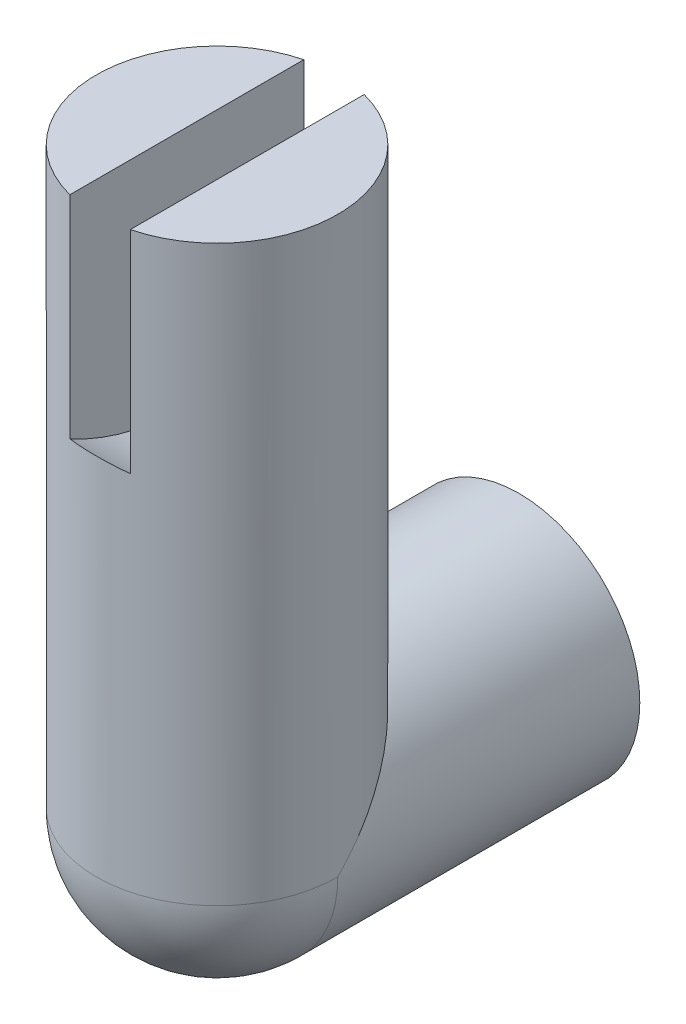
ISO-10303-21;
HEADER;
FILE_DESCRIPTION(('STEP AP214'),'2;1');
FILE_NAME('part.step','',(''),(''),'','','');
FILE_SCHEMA(('AUTOMOTIVE_DESIGN { 1 0 10303 214 1 1 1 1 }'));
ENDSEC;
DATA;
#1=APPLICATION_CONTEXT('core data for automotive mechanical design processes');
#2=APPLICATION_PROTOCOL_DEFINITION('international standard','automotive_design',2000,#1);
#3=PRODUCT_CONTEXT('',#1,'mechanical');
#4=PRODUCT('Part','Part','',(#3));
#5=PRODUCT_RELATED_PRODUCT_CATEGORY('part','',(#4));
#6=PRODUCT_DEFINITION_FORMATION('','',#4);
#7=PRODUCT_DEFINITION_CONTEXT('part definition',#1,'design');
#8=PRODUCT_DEFINITION('design','',#6,#7);
#9=PRODUCT_DEFINITION_SHAPE('','',#8);
#10=(LENGTH_UNIT() NAMED_UNIT(*) SI_UNIT(.MILLI.,.METRE.));
#11=(NAMED_UNIT(*) PLANE_ANGLE_UNIT() SI_UNIT($,.RADIAN.));
#12=(NAMED_UNIT(*) SI_UNIT($,.STERADIAN.) SOLID_ANGLE_UNIT());
#13=UNCERTAINTY_MEASURE_WITH_UNIT(LENGTH_MEASURE(1.E-05),#10,'distance_accuracy_value','');
#14=(GEOMETRIC_REPRESENTATION_CONTEXT(3) GLOBAL_UNCERTAINTY_ASSIGNED_CONTEXT((#13)) GLOBAL_UNIT_ASSIGNED_CONTEXT((#10,
#11,#12)) REPRESENTATION_CONTEXT('',''));
#15=CARTESIAN_POINT('',(0.,0.,0.));
#16=DIRECTION('',(0.,0.,1.));
#17=DIRECTION('',(1.,0.,0.));
#18=AXIS2_PLACEMENT_3D('',#15,#16,#17);
#19=CARTESIAN_POINT('',(0.,63.6491228070176,0.));
#20=DIRECTION('',(0.,-1.,0.));
#21=DIRECTION('',(0.,0.,-1.));
#22=AXIS2_PLACEMENT_3D('',#19,#20,#21);
#23=PLANE('',#22);
#24=CARTESIAN_POINT('',(0.,63.6491228070176,0.));
#25=DIRECTION('',(0.,-1.,0.));
#26=DIRECTION('',(0.,0.,-1.));
#27=AXIS2_PLACEMENT_3D('',#24,#25,#26);
#28=CIRCLE('',#27,4.);
#29=CARTESIAN_POINT('',(1.,63.6491228070176,-3.87298334620742));
#30=VERTEX_POINT('',#29);
#31=CARTESIAN_POINT('',(1.,63.6491228070176,3.87298334620742));
#32=VERTEX_POINT('',#31);
#33=EDGE_CURVE('E91',#30,#32,#28,.T.);
#34=ORIENTED_EDGE('',*,*,#33,.F.);
#35=DIRECTION('',(0.,0.,1.));
#36=VECTOR('',#35,1.);
#37=CARTESIAN_POINT('',(1.,63.6491228070176,0.));
#38=LINE('',#37,#36);
#39=EDGE_CURVE('E95',#30,#32,#38,.T.);
#40=ORIENTED_EDGE('',*,*,#39,.T.);
#41=EDGE_LOOP('',(#34,#40));
#42=FACE_BOUND('',#41,.T.);
#43=ADVANCED_FACE('F36',(#42),#23,.F.);
#44=CARTESIAN_POINT('',(0.,44.6491228070175,-10.));
#45=DIRECTION('',(0.,0.,1.));
#46=DIRECTION('',(1.,0.,0.));
#47=AXIS2_PLACEMENT_3D('',#44,#45,#46);
#48=CYLINDRICAL_SURFACE('',#47,4.);
#49=CARTESIAN_POINT('',(0.,44.6491228070175,-10.));
#50=DIRECTION('',(0.,0.,1.));
#51=DIRECTION('',(1.,0.,0.));
#52=AXIS2_PLACEMENT_3D('',#49,#50,#51);
#53=CIRCLE('',#52,4.);
#54=CARTESIAN_POINT('',(4.,44.6491228070175,-10.));
#55=VERTEX_POINT('',#54);
#56=EDGE_CURVE('E86',#55,#55,#53,.T.);
#57=ORIENTED_EDGE('',*,*,#56,.T.);
#58=EDGE_LOOP('',(#57));
#59=FACE_BOUND('',#58,.T.);
#60=CARTESIAN_POINT('',(0.,44.6491228070175,0.));
#61=DIRECTION('',(0.,0.,1.));
#62=DIRECTION('',(1.,0.,0.));
#63=AXIS2_PLACEMENT_3D('',#60,#61,#62);
#64=CIRCLE('',#63,4.);
#65=CARTESIAN_POINT('',(-4.,44.6491228070175,0.));
#66=VERTEX_POINT('',#65);
#67=CARTESIAN_POINT('',(4.,44.6491228070175,0.));
#68=VERTEX_POINT('',#67);
#69=EDGE_CURVE('E83',#66,#68,#64,.T.);
#70=ORIENTED_EDGE('',*,*,#69,.F.);
#71=CARTESIAN_POINT('',(0.,44.6491228070175,0.));
#72=DIRECTION('',(0.,0.707106781186547,0.707106781186547));
#73=DIRECTION('',(0.,-0.707106781186547,0.707106781186547));
#74=AXIS2_PLACEMENT_3D('',#71,#72,#73);
#75=ELLIPSE('',#74,5.65685424949238,4.);
#76=EDGE_CURVE('E84',#66,#68,#75,.F.);
#77=ORIENTED_EDGE('',*,*,#76,.T.);
#78=EDGE_LOOP('',(#70,#77));
#79=FACE_BOUND('',#78,.T.);
#80=ADVANCED_FACE('F38',(#59,#79),#48,.T.);
#81=CARTESIAN_POINT('',(0.,44.6491228070175,-10.));
#82=DIRECTION('',(0.,0.,1.));
#83=DIRECTION('',(1.,0.,0.));
#84=AXIS2_PLACEMENT_3D('',#81,#82,#83);
#85=PLANE('',#84);
#86=CARTESIAN_POINT('',(0.,44.6491228070175,-10.));
#87=DIRECTION('',(0.,0.,-1.));
#88=DIRECTION('',(-1.,0.,0.));
#89=AXIS2_PLACEMENT_3D('',#86,#87,#88);
#90=CIRCLE('',#89,3.);
#91=CARTESIAN_POINT('',(-3.,44.6491228070175,-10.));
#92=VERTEX_POINT('',#91);
#93=EDGE_CURVE('E90',#92,#92,#90,.T.);
#94=ORIENTED_EDGE('',*,*,#93,.F.);
#95=EDGE_LOOP('',(#94));
#96=FACE_BOUND('',#95,.T.);
#97=ORIENTED_EDGE('',*,*,#56,.F.);
#98=EDGE_LOOP('',(#97));
#99=FACE_BOUND('',#98,.T.);
#100=ADVANCED_FACE('F160',(#96,#99),#85,.F.);
#101=CARTESIAN_POINT('',(0.,44.6491228070175,-5.));
#102=DIRECTION('',(0.,0.,-1.));
#103=DIRECTION('',(-1.,0.,0.));
#104=AXIS2_PLACEMENT_3D('',#101,#102,#103);
#105=CYLINDRICAL_SURFACE('',#104,3.);
#106=CARTESIAN_POINT('',(0.,44.6491228070175,-5.));
#107=DIRECTION('',(0.,0.,-1.));
#108=DIRECTION('',(-1.,0.,0.));
#109=AXIS2_PLACEMENT_3D('',#106,#107,#108);
#110=CIRCLE('',#109,3.);
#111=CARTESIAN_POINT('',(-3.,44.6491228070175,-5.));
#112=VERTEX_POINT('',#111);
#113=EDGE_CURVE('E87',#112,#112,#110,.T.);
#114=ORIENTED_EDGE('',*,*,#113,.F.);
#115=EDGE_LOOP('',(#114));
#116=FACE_BOUND('',#115,.T.);
#117=ORIENTED_EDGE('',*,*,#93,.T.);
#118=EDGE_LOOP('',(#117));
#119=FACE_BOUND('',#118,.T.);
#120=ADVANCED_FACE('F169',(#116,#119),#105,.F.);
#121=CARTESIAN_POINT('',(0.,44.6491228070175,-5.));
#122=DIRECTION('',(0.,0.,-1.));
#123=DIRECTION('',(-1.,0.,0.));
#124=AXIS2_PLACEMENT_3D('',#121,#122,#123);
#125=PLANE('',#124);
#126=ORIENTED_EDGE('',*,*,#113,.T.);
#127=EDGE_LOOP('',(#126));
#128=FACE_BOUND('',#127,.T.);
#129=ADVANCED_FACE('F164',(#128),#125,.T.);
#130=CARTESIAN_POINT('',(-1.,63.6491228070176,3.87298334620742));
#131=VERTEX_POINT('',#130);
#132=CARTESIAN_POINT('',(-1.,63.6491228070176,-3.87298334620742));
#133=VERTEX_POINT('',#132);
#134=EDGE_CURVE('E94',#131,#133,#28,.T.);
#135=ORIENTED_EDGE('',*,*,#134,.F.);
#136=DIRECTION('',(0.,0.,-1.));
#137=VECTOR('',#136,1.);
#138=CARTESIAN_POINT('',(-1.,63.6491228070176,0.));
#139=LINE('',#138,#137);
#140=EDGE_CURVE('E100',#131,#133,#139,.T.);
#141=ORIENTED_EDGE('',*,*,#140,.T.);
#142=EDGE_LOOP('',(#135,#141));
#143=FACE_BOUND('',#142,.T.);
#144=ADVANCED_FACE('F145',(#143),#23,.F.);
#145=CARTESIAN_POINT('',(0.,44.6491228070175,0.));
#146=DIRECTION('',(0.,-1.,0.));
#147=DIRECTION('',(0.,0.,-1.));
#148=AXIS2_PLACEMENT_3D('',#145,#146,#147);
#149=CYLINDRICAL_SURFACE('',#148,4.);
#150=CARTESIAN_POINT('',(-1.,56.6491228070176,-3.87298334620742));
#151=CARTESIAN_POINT('',(-0.903616678226752,56.6629139650696,-3.89788439285655));
#152=CARTESIAN_POINT('',(-0.806037731060894,56.6748827259765,-3.91922637979248));
#153=CARTESIAN_POINT('',(-0.60913073494813,56.6948776204859,-3.95460992732939));
#154=CARTESIAN_POINT('',(-0.509802031392557,56.7029022446279,-3.96864869303435));
#155=CARTESIAN_POINT('',(-0.312507318003729,56.7145585311242,-3.98897739304384));
#156=CARTESIAN_POINT('',(-0.214565769638815,56.7182909467812,-3.99544511482759));
#157=CARTESIAN_POINT('',(-0.0184547661765573,56.7215890132971,-4.00116050419917));
#158=CARTESIAN_POINT('',(0.0797145872474584,56.7211562597283,-4.00041093655014));
#159=CARTESIAN_POINT('',(0.315690963733715,56.7150989450744,-3.9899107189796));
#160=CARTESIAN_POINT('',(0.453316386341276,56.7074267179779,-3.97660989565228));
#161=CARTESIAN_POINT('',(0.65878708333481,56.6900134644301,-3.9460011277571));
#162=CARTESIAN_POINT('',(0.727710489808318,56.6831385878801,-3.93386857300271));
#163=CARTESIAN_POINT('',(0.864608020540599,56.6675094464496,-3.90606266165358));
#164=CARTESIAN_POINT('',(0.932582355895414,56.6587556068231,-3.89039010620331));
#165=CARTESIAN_POINT('',(1.,56.6491228070176,-3.87298334620742));
#166=B_SPLINE_CURVE_WITH_KNOTS('',3,(#150,#151,#152,#153,#154,#155,#156,#157,#158,#159,#160,
#161,#162,#163,#164,#165),.UNSPECIFIED.,.F.,.F.,(4,2,2,2,2,2,2,4),(0.,0.301432668315564,
0.602980608280495,0.897295580702562,1.1914978129039,1.60582250455408,1.81668179338781,
2.02749340997263),.UNSPECIFIED.);
#167=CARTESIAN_POINT('',(-1.,56.6491228070176,-3.87298334620742));
#168=VERTEX_POINT('',#167);
#169=CARTESIAN_POINT('',(1.,56.6491228070176,-3.87298334620742));
#170=VERTEX_POINT('',#169);
#171=EDGE_CURVE('E132',#168,#170,#166,.T.);
#172=ORIENTED_EDGE('',*,*,#171,.T.);
#173=DIRECTION('',(0.,-1.,0.));
#174=VECTOR('',#173,1.);
#175=CARTESIAN_POINT('',(1.,44.6491228070175,-3.87298334620742));
#176=LINE('',#175,#174);
#177=EDGE_CURVE('E11',#170,#30,#176,.F.);
#178=ORIENTED_EDGE('',*,*,#177,.T.);
#179=ORIENTED_EDGE('',*,*,#33,.T.);
#180=DIRECTION('',(0.,-1.,0.));
#181=VECTOR('',#180,1.);
#182=CARTESIAN_POINT('',(1.,44.6491228070175,3.87298334620742));
#183=LINE('',#182,#181);
#184=CARTESIAN_POINT('',(1.,56.6491228070176,3.87298334620742));
#185=VERTEX_POINT('',#184);
#186=EDGE_CURVE('E137',#32,#185,#183,.T.);
#187=ORIENTED_EDGE('',*,*,#186,.T.);
#188=CARTESIAN_POINT('',(1.,56.6491228070176,3.87298334620742));
#189=CARTESIAN_POINT('',(0.903616678226752,56.6629139650696,3.89788439285655));
#190=CARTESIAN_POINT('',(0.806037731060894,56.6748827259765,3.91922637979248));
#191=CARTESIAN_POINT('',(0.60913073494813,56.6948776204859,3.95460992732939));
#192=CARTESIAN_POINT('',(0.509802031392557,56.7029022446279,3.96864869303435));
#193=CARTESIAN_POINT('',(0.312507318003729,56.7145585311242,3.98897739304384));
#194=CARTESIAN_POINT('',(0.214565769638815,56.7182909467812,3.99544511482759));
#195=CARTESIAN_POINT('',(0.0184547661765573,56.7215890132971,4.00116050419917));
#196=CARTESIAN_POINT('',(-0.0797145872474584,56.7211562597283,4.00041093655014));
#197=CARTESIAN_POINT('',(-0.315690963733715,56.7150989450744,3.9899107189796));
#198=CARTESIAN_POINT('',(-0.453316386341276,56.7074267179779,3.97660989565228));
#199=CARTESIAN_POINT('',(-0.65878708333481,56.6900134644301,3.9460011277571));
#200=CARTESIAN_POINT('',(-0.727710489808318,56.6831385878801,3.93386857300271));
#201=CARTESIAN_POINT('',(-0.864608020540599,56.6675094464496,3.90606266165358));
#202=CARTESIAN_POINT('',(-0.932582355895414,56.6587556068231,3.89039010620331));
#203=CARTESIAN_POINT('',(-1.,56.6491228070176,3.87298334620742));
#204=B_SPLINE_CURVE_WITH_KNOTS('',3,(#188,#189,#190,#191,#192,#193,#194,#195,#196,#197,#198,
#199,#200,#201,#202,#203),.UNSPECIFIED.,.F.,.F.,(4,2,2,2,2,2,2,4),(0.,0.301432668315564,
0.602980608280495,0.897295580702562,1.1914978129039,1.60582250455408,1.81668179338781,
2.02749340997263),.UNSPECIFIED.);
#205=CARTESIAN_POINT('',(-1.,56.6491228070176,3.87298334620742));
#206=VERTEX_POINT('',#205);
#207=EDGE_CURVE('E110',#185,#206,#204,.T.);
#208=ORIENTED_EDGE('',*,*,#207,.T.);
#209=DIRECTION('',(0.,-1.,0.));
#210=VECTOR('',#209,1.);
#211=CARTESIAN_POINT('',(-1.,44.6491228070175,3.87298334620742));
#212=LINE('',#211,#210);
#213=EDGE_CURVE('E119',#206,#131,#212,.F.);
#214=ORIENTED_EDGE('',*,*,#213,.T.);
#215=ORIENTED_EDGE('',*,*,#134,.T.);
#216=DIRECTION('',(0.,-1.,0.));
#217=VECTOR('',#216,1.);
#218=CARTESIAN_POINT('',(-1.,44.6491228070175,-3.87298334620742));
#219=LINE('',#218,#217);
#220=EDGE_CURVE('E44',#133,#168,#219,.T.);
#221=ORIENTED_EDGE('',*,*,#220,.T.);
#222=EDGE_LOOP('',(#172,#178,#179,#187,#208,#214,#215,#221));
#223=FACE_BOUND('',#222,.T.);
#224=ORIENTED_EDGE('',*,*,#76,.F.);
#225=CARTESIAN_POINT('',(0.,44.6491228070175,0.));
#226=DIRECTION('',(0.,-1.,0.));
#227=DIRECTION('',(0.,0.,-1.));
#228=AXIS2_PLACEMENT_3D('',#225,#226,#227);
#229=CIRCLE('',#228,4.);
#230=EDGE_CURVE('E58',#68,#66,#229,.T.);
#231=ORIENTED_EDGE('',*,*,#230,.F.);
#232=EDGE_LOOP('',(#224,#231));
#233=FACE_BOUND('',#232,.T.);
#234=ADVANCED_FACE('F89',(#223,#233),#149,.T.);
#235=CARTESIAN_POINT('',(1.,63.6491228070176,-8.));
#236=DIRECTION('',(1.,0.,0.));
#237=DIRECTION('',(0.,0.,-1.));
#238=AXIS2_PLACEMENT_3D('',#235,#236,#237);
#239=PLANE('',#238);
#240=ORIENTED_EDGE('',*,*,#39,.F.);
#241=ORIENTED_EDGE('',*,*,#177,.F.);
#242=CARTESIAN_POINT('',(1.,63.6491228070176,0.));
#243=DIRECTION('',(1.,0.,0.));
#244=DIRECTION('',(0.,0.,-1.));
#245=AXIS2_PLACEMENT_3D('',#242,#243,#244);
#246=CIRCLE('',#245,8.);
#247=EDGE_CURVE('E146',#185,#170,#246,.T.);
#248=ORIENTED_EDGE('',*,*,#247,.F.);
#249=ORIENTED_EDGE('',*,*,#186,.F.);
#250=EDGE_LOOP('',(#240,#241,#248,#249));
#251=FACE_BOUND('',#250,.T.);
#252=ADVANCED_FACE('F153',(#251),#239,.F.);
#253=CARTESIAN_POINT('',(-1.,63.6491228070176,0.));
#254=DIRECTION('',(-1.,0.,0.));
#255=DIRECTION('',(0.,0.,1.));
#256=AXIS2_PLACEMENT_3D('',#253,#254,#255);
#257=PLANE('',#256);
#258=ORIENTED_EDGE('',*,*,#140,.F.);
#259=ORIENTED_EDGE('',*,*,#213,.F.);
#260=CARTESIAN_POINT('',(-1.,63.6491228070176,0.));
#261=DIRECTION('',(1.,0.,0.));
#262=DIRECTION('',(0.,0.,-1.));
#263=AXIS2_PLACEMENT_3D('',#260,#261,#262);
#264=CIRCLE('',#263,8.);
#265=EDGE_CURVE('E51',#206,#168,#264,.T.);
#266=ORIENTED_EDGE('',*,*,#265,.T.);
#267=ORIENTED_EDGE('',*,*,#220,.F.);
#268=EDGE_LOOP('',(#258,#259,#266,#267));
#269=FACE_BOUND('',#268,.T.);
#270=ADVANCED_FACE('F129',(#269),#257,.F.);
#271=CARTESIAN_POINT('',(1.,63.6491228070176,0.));
#272=DIRECTION('',(1.,0.,0.));
#273=DIRECTION('',(0.,0.,-1.));
#274=AXIS2_PLACEMENT_3D('',#271,#272,#273);
#275=CYLINDRICAL_SURFACE('',#274,8.);
#276=ORIENTED_EDGE('',*,*,#265,.F.);
#277=ORIENTED_EDGE('',*,*,#207,.F.);
#278=ORIENTED_EDGE('',*,*,#247,.T.);
#279=ORIENTED_EDGE('',*,*,#171,.F.);
#280=EDGE_LOOP('',(#276,#277,#278,#279));
#281=FACE_BOUND('',#280,.T.);
#282=ADVANCED_FACE('F124',(#281),#275,.F.);
#283=CARTESIAN_POINT('',(0.,44.6491228070175,0.));
#284=DIRECTION('',(-1.,0.,0.));
#285=DIRECTION('',(0.,0.,1.));
#286=AXIS2_PLACEMENT_3D('',#283,#284,#285);
#287=SPHERICAL_SURFACE('',#286,4.);
#288=ORIENTED_EDGE('',*,*,#69,.T.);
#289=ORIENTED_EDGE('',*,*,#230,.T.);
#290=EDGE_LOOP('',(#288,#289));
#291=FACE_BOUND('',#290,.T.);
#292=ADVANCED_FACE('F93',(#291),#287,.T.);
#293=CLOSED_SHELL('',(#43,#80,#100,#120,#129,#144,#234,#252,#270,#282,#292));
#294=MANIFOLD_SOLID_BREP('B2',#293);
#295=ADVANCED_BREP_SHAPE_REPRESENTATION('',(#18,#294),#14);
#296=SHAPE_DEFINITION_REPRESENTATION(#9,#295);
ENDSEC;
END-ISO-10303-21;
